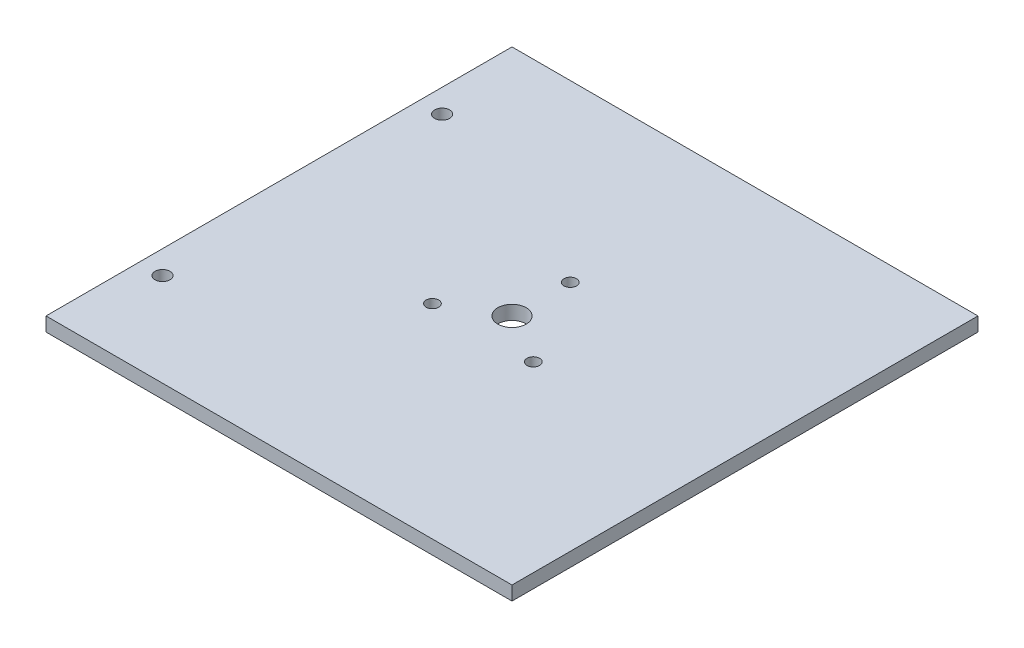
ISO-10303-21;
HEADER;
FILE_DESCRIPTION(('STEP AP214'),'2;1');
FILE_NAME('part.step','',(''),(''),'','','');
FILE_SCHEMA(('AUTOMOTIVE_DESIGN { 1 0 10303 214 1 1 1 1 }'));
ENDSEC;
DATA;
#1=APPLICATION_CONTEXT('core data for automotive mechanical design processes');
#2=APPLICATION_PROTOCOL_DEFINITION('international standard','automotive_design',2000,#1);
#3=PRODUCT_CONTEXT('',#1,'mechanical');
#4=PRODUCT('Part','Part','',(#3));
#5=PRODUCT_RELATED_PRODUCT_CATEGORY('part','',(#4));
#6=PRODUCT_DEFINITION_FORMATION('','',#4);
#7=PRODUCT_DEFINITION_CONTEXT('part definition',#1,'design');
#8=PRODUCT_DEFINITION('design','',#6,#7);
#9=PRODUCT_DEFINITION_SHAPE('','',#8);
#10=(LENGTH_UNIT() NAMED_UNIT(*) SI_UNIT(.MILLI.,.METRE.));
#11=(NAMED_UNIT(*) PLANE_ANGLE_UNIT() SI_UNIT($,.RADIAN.));
#12=(NAMED_UNIT(*) SI_UNIT($,.STERADIAN.) SOLID_ANGLE_UNIT());
#13=UNCERTAINTY_MEASURE_WITH_UNIT(LENGTH_MEASURE(1.E-05),#10,'distance_accuracy_value','');
#14=(GEOMETRIC_REPRESENTATION_CONTEXT(3) GLOBAL_UNCERTAINTY_ASSIGNED_CONTEXT((#13)) GLOBAL_UNIT_ASSIGNED_CONTEXT((#10,
#11,#12)) REPRESENTATION_CONTEXT('',''));
#15=CARTESIAN_POINT('',(0.,0.,0.));
#16=DIRECTION('',(0.,0.,1.));
#17=DIRECTION('',(1.,0.,0.));
#18=AXIS2_PLACEMENT_3D('',#15,#16,#17);
#19=CARTESIAN_POINT('',(-50.,-63.,-50.));
#20=DIRECTION('',(1.,0.,0.));
#21=DIRECTION('',(0.,0.,-1.));
#22=AXIS2_PLACEMENT_3D('',#19,#20,#21);
#23=PLANE('',#22);
#24=DIRECTION('',(0.,0.,-1.));
#25=VECTOR('',#24,1.);
#26=CARTESIAN_POINT('',(-50.,-60.,-50.));
#27=LINE('',#26,#25);
#28=CARTESIAN_POINT('',(-50.,-60.,50.));
#29=VERTEX_POINT('',#28);
#30=CARTESIAN_POINT('',(-50.,-60.,-50.));
#31=VERTEX_POINT('',#30);
#32=EDGE_CURVE('E99',#29,#31,#27,.T.);
#33=ORIENTED_EDGE('',*,*,#32,.T.);
#34=DIRECTION('',(0.,1.,0.));
#35=VECTOR('',#34,1.);
#36=CARTESIAN_POINT('',(-50.,-63.,-50.));
#37=LINE('',#36,#35);
#38=CARTESIAN_POINT('',(-50.,-63.,-50.));
#39=VERTEX_POINT('',#38);
#40=EDGE_CURVE('E11',#39,#31,#37,.T.);
#41=ORIENTED_EDGE('',*,*,#40,.F.);
#42=DIRECTION('',(0.,0.,-1.));
#43=VECTOR('',#42,1.);
#44=CARTESIAN_POINT('',(-50.,-63.,-50.));
#45=LINE('',#44,#43);
#46=CARTESIAN_POINT('',(-50.,-63.,50.));
#47=VERTEX_POINT('',#46);
#48=EDGE_CURVE('E87',#47,#39,#45,.T.);
#49=ORIENTED_EDGE('',*,*,#48,.F.);
#50=DIRECTION('',(0.,1.,0.));
#51=VECTOR('',#50,1.);
#52=CARTESIAN_POINT('',(-50.,-63.,50.));
#53=LINE('',#52,#51);
#54=EDGE_CURVE('E95',#47,#29,#53,.T.);
#55=ORIENTED_EDGE('',*,*,#54,.T.);
#56=EDGE_LOOP('',(#33,#41,#49,#55));
#57=FACE_BOUND('',#56,.T.);
#58=ADVANCED_FACE('F36',(#57),#23,.F.);
#59=CARTESIAN_POINT('',(-50.,-63.,-50.));
#60=DIRECTION('',(0.,0.,1.));
#61=DIRECTION('',(1.,0.,0.));
#62=AXIS2_PLACEMENT_3D('',#59,#60,#61);
#63=PLANE('',#62);
#64=DIRECTION('',(1.,0.,0.));
#65=VECTOR('',#64,1.);
#66=CARTESIAN_POINT('',(-50.,-60.,-50.));
#67=LINE('',#66,#65);
#68=CARTESIAN_POINT('',(50.,-60.,-50.));
#69=VERTEX_POINT('',#68);
#70=EDGE_CURVE('E91',#31,#69,#67,.T.);
#71=ORIENTED_EDGE('',*,*,#70,.T.);
#72=DIRECTION('',(0.,1.,0.));
#73=VECTOR('',#72,1.);
#74=CARTESIAN_POINT('',(50.,-63.,-50.));
#75=LINE('',#74,#73);
#76=CARTESIAN_POINT('',(50.,-63.,-50.));
#77=VERTEX_POINT('',#76);
#78=EDGE_CURVE('E44',#77,#69,#75,.T.);
#79=ORIENTED_EDGE('',*,*,#78,.F.);
#80=DIRECTION('',(1.,0.,0.));
#81=VECTOR('',#80,1.);
#82=CARTESIAN_POINT('',(-50.,-63.,-50.));
#83=LINE('',#82,#81);
#84=EDGE_CURVE('E82',#39,#77,#83,.T.);
#85=ORIENTED_EDGE('',*,*,#84,.F.);
#86=ORIENTED_EDGE('',*,*,#40,.T.);
#87=EDGE_LOOP('',(#71,#79,#85,#86));
#88=FACE_BOUND('',#87,.T.);
#89=ADVANCED_FACE('F90',(#88),#63,.F.);
#90=CARTESIAN_POINT('',(50.,-63.,-50.));
#91=DIRECTION('',(-1.,0.,0.));
#92=DIRECTION('',(0.,0.,1.));
#93=AXIS2_PLACEMENT_3D('',#90,#91,#92);
#94=PLANE('',#93);
#95=DIRECTION('',(0.,0.,1.));
#96=VECTOR('',#95,1.);
#97=CARTESIAN_POINT('',(50.,-60.,-50.));
#98=LINE('',#97,#96);
#99=CARTESIAN_POINT('',(50.,-60.,50.));
#100=VERTEX_POINT('',#99);
#101=EDGE_CURVE('E69',#69,#100,#98,.T.);
#102=ORIENTED_EDGE('',*,*,#101,.T.);
#103=DIRECTION('',(0.,1.,0.));
#104=VECTOR('',#103,1.);
#105=CARTESIAN_POINT('',(50.,-63.,50.));
#106=LINE('',#105,#104);
#107=CARTESIAN_POINT('',(50.,-63.,50.));
#108=VERTEX_POINT('',#107);
#109=EDGE_CURVE('E92',#108,#100,#106,.T.);
#110=ORIENTED_EDGE('',*,*,#109,.F.);
#111=DIRECTION('',(0.,0.,1.));
#112=VECTOR('',#111,1.);
#113=CARTESIAN_POINT('',(50.,-63.,-50.));
#114=LINE('',#113,#112);
#115=EDGE_CURVE('E85',#77,#108,#114,.T.);
#116=ORIENTED_EDGE('',*,*,#115,.F.);
#117=ORIENTED_EDGE('',*,*,#78,.T.);
#118=EDGE_LOOP('',(#102,#110,#116,#117));
#119=FACE_BOUND('',#118,.T.);
#120=ADVANCED_FACE('F93',(#119),#94,.F.);
#121=CARTESIAN_POINT('',(-50.,-63.,50.));
#122=DIRECTION('',(0.,0.,-1.));
#123=DIRECTION('',(-1.,0.,0.));
#124=AXIS2_PLACEMENT_3D('',#121,#122,#123);
#125=PLANE('',#124);
#126=DIRECTION('',(-1.,0.,0.));
#127=VECTOR('',#126,1.);
#128=CARTESIAN_POINT('',(-50.,-60.,50.));
#129=LINE('',#128,#127);
#130=EDGE_CURVE('E75',#100,#29,#129,.T.);
#131=ORIENTED_EDGE('',*,*,#130,.T.);
#132=ORIENTED_EDGE('',*,*,#54,.F.);
#133=DIRECTION('',(-1.,0.,0.));
#134=VECTOR('',#133,1.);
#135=CARTESIAN_POINT('',(-50.,-63.,50.));
#136=LINE('',#135,#134);
#137=EDGE_CURVE('E52',#108,#47,#136,.T.);
#138=ORIENTED_EDGE('',*,*,#137,.F.);
#139=ORIENTED_EDGE('',*,*,#109,.T.);
#140=EDGE_LOOP('',(#131,#132,#138,#139));
#141=FACE_BOUND('',#140,.T.);
#142=ADVANCED_FACE('F107',(#141),#125,.F.);
#143=CARTESIAN_POINT('',(0.,-63.,0.));
#144=DIRECTION('',(0.,1.,0.));
#145=DIRECTION('',(0.,0.,1.));
#146=AXIS2_PLACEMENT_3D('',#143,#144,#145);
#147=PLANE('',#146);
#148=CARTESIAN_POINT('',(-45.,-63.,-30.));
#149=DIRECTION('',(0.,-1.,0.));
#150=DIRECTION('',(0.,0.,-1.));
#151=AXIS2_PLACEMENT_3D('',#148,#149,#150);
#152=CIRCLE('',#151,1.6);
#153=CARTESIAN_POINT('',(-45.,-63.,-31.6));
#154=VERTEX_POINT('',#153);
#155=EDGE_CURVE('E123',#154,#154,#152,.T.);
#156=ORIENTED_EDGE('',*,*,#155,.F.);
#157=EDGE_LOOP('',(#156));
#158=FACE_BOUND('',#157,.T.);
#159=CARTESIAN_POINT('',(-45.,-63.,30.));
#160=DIRECTION('',(0.,-1.,0.));
#161=DIRECTION('',(0.,0.,-1.));
#162=AXIS2_PLACEMENT_3D('',#159,#160,#161);
#163=CIRCLE('',#162,1.6);
#164=CARTESIAN_POINT('',(-45.,-63.,28.4));
#165=VERTEX_POINT('',#164);
#166=EDGE_CURVE('E140',#165,#165,#163,.T.);
#167=ORIENTED_EDGE('',*,*,#166,.F.);
#168=EDGE_LOOP('',(#167));
#169=FACE_BOUND('',#168,.T.);
#170=CARTESIAN_POINT('',(10.8253175473055,-63.,6.25));
#171=DIRECTION('',(0.,-1.,0.));
#172=DIRECTION('',(0.,0.,-1.));
#173=AXIS2_PLACEMENT_3D('',#170,#171,#172);
#174=CIRCLE('',#173,1.35);
#175=CARTESIAN_POINT('',(10.8253175473055,-63.,4.9));
#176=VERTEX_POINT('',#175);
#177=EDGE_CURVE('E122',#176,#176,#174,.T.);
#178=ORIENTED_EDGE('',*,*,#177,.F.);
#179=EDGE_LOOP('',(#178));
#180=FACE_BOUND('',#179,.T.);
#181=CARTESIAN_POINT('',(-10.8253175473055,-63.,6.24999999999999));
#182=DIRECTION('',(0.,-1.,0.));
#183=DIRECTION('',(0.,0.,-1.));
#184=AXIS2_PLACEMENT_3D('',#181,#182,#183);
#185=CIRCLE('',#184,1.35);
#186=CARTESIAN_POINT('',(-10.8253175473055,-63.,4.89999999999999));
#187=VERTEX_POINT('',#186);
#188=EDGE_CURVE('E129',#187,#187,#185,.T.);
#189=ORIENTED_EDGE('',*,*,#188,.F.);
#190=EDGE_LOOP('',(#189));
#191=FACE_BOUND('',#190,.T.);
#192=CARTESIAN_POINT('',(0.,-63.,-12.5));
#193=DIRECTION('',(0.,-1.,0.));
#194=DIRECTION('',(0.,0.,-1.));
#195=AXIS2_PLACEMENT_3D('',#192,#193,#194);
#196=CIRCLE('',#195,1.35);
#197=CARTESIAN_POINT('',(0.,-63.,-13.85));
#198=VERTEX_POINT('',#197);
#199=EDGE_CURVE('E116',#198,#198,#196,.T.);
#200=ORIENTED_EDGE('',*,*,#199,.F.);
#201=EDGE_LOOP('',(#200));
#202=FACE_BOUND('',#201,.T.);
#203=CARTESIAN_POINT('',(0.,-63.,0.));
#204=DIRECTION('',(0.,-1.,0.));
#205=DIRECTION('',(0.,0.,-1.));
#206=AXIS2_PLACEMENT_3D('',#203,#204,#205);
#207=CIRCLE('',#206,3.05);
#208=CARTESIAN_POINT('',(0.,-63.,-3.05));
#209=VERTEX_POINT('',#208);
#210=EDGE_CURVE('E102',#209,#209,#207,.T.);
#211=ORIENTED_EDGE('',*,*,#210,.F.);
#212=EDGE_LOOP('',(#211));
#213=FACE_BOUND('',#212,.T.);
#214=ORIENTED_EDGE('',*,*,#48,.T.);
#215=ORIENTED_EDGE('',*,*,#84,.T.);
#216=ORIENTED_EDGE('',*,*,#115,.T.);
#217=ORIENTED_EDGE('',*,*,#137,.T.);
#218=EDGE_LOOP('',(#214,#215,#216,#217));
#219=FACE_BOUND('',#218,.T.);
#220=ADVANCED_FACE('F83',(#158,#169,#180,#191,#202,#213,#219),#147,.F.);
#221=CARTESIAN_POINT('',(0.,-60.,0.));
#222=DIRECTION('',(0.,1.,0.));
#223=DIRECTION('',(0.,0.,1.));
#224=AXIS2_PLACEMENT_3D('',#221,#222,#223);
#225=PLANE('',#224);
#226=CARTESIAN_POINT('',(-45.,-60.,-30.));
#227=DIRECTION('',(0.,1.,0.));
#228=DIRECTION('',(0.,0.,1.));
#229=AXIS2_PLACEMENT_3D('',#226,#227,#228);
#230=CIRCLE('',#229,1.6);
#231=CARTESIAN_POINT('',(-45.,-60.,-28.4));
#232=VERTEX_POINT('',#231);
#233=EDGE_CURVE('E143',#232,#232,#230,.F.);
#234=ORIENTED_EDGE('',*,*,#233,.T.);
#235=EDGE_LOOP('',(#234));
#236=FACE_BOUND('',#235,.T.);
#237=CARTESIAN_POINT('',(-45.,-60.,30.));
#238=DIRECTION('',(0.,1.,0.));
#239=DIRECTION('',(0.,0.,1.));
#240=AXIS2_PLACEMENT_3D('',#237,#238,#239);
#241=CIRCLE('',#240,1.6);
#242=CARTESIAN_POINT('',(-45.,-60.,31.6));
#243=VERTEX_POINT('',#242);
#244=EDGE_CURVE('E137',#243,#243,#241,.F.);
#245=ORIENTED_EDGE('',*,*,#244,.T.);
#246=EDGE_LOOP('',(#245));
#247=FACE_BOUND('',#246,.T.);
#248=CARTESIAN_POINT('',(10.8253175473055,-60.,6.25));
#249=DIRECTION('',(0.,1.,0.));
#250=DIRECTION('',(0.,0.,1.));
#251=AXIS2_PLACEMENT_3D('',#248,#249,#250);
#252=CIRCLE('',#251,1.35);
#253=CARTESIAN_POINT('',(10.8253175473055,-60.,7.6));
#254=VERTEX_POINT('',#253);
#255=EDGE_CURVE('E119',#254,#254,#252,.F.);
#256=ORIENTED_EDGE('',*,*,#255,.T.);
#257=EDGE_LOOP('',(#256));
#258=FACE_BOUND('',#257,.T.);
#259=CARTESIAN_POINT('',(-10.8253175473055,-60.,6.24999999999999));
#260=DIRECTION('',(0.,1.,0.));
#261=DIRECTION('',(0.,0.,1.));
#262=AXIS2_PLACEMENT_3D('',#259,#260,#261);
#263=CIRCLE('',#262,1.35);
#264=CARTESIAN_POINT('',(-10.8253175473055,-60.,7.59999999999999));
#265=VERTEX_POINT('',#264);
#266=EDGE_CURVE('E126',#265,#265,#263,.F.);
#267=ORIENTED_EDGE('',*,*,#266,.T.);
#268=EDGE_LOOP('',(#267));
#269=FACE_BOUND('',#268,.T.);
#270=CARTESIAN_POINT('',(0.,-60.,-12.5));
#271=DIRECTION('',(0.,1.,0.));
#272=DIRECTION('',(0.,0.,1.));
#273=AXIS2_PLACEMENT_3D('',#270,#271,#272);
#274=CIRCLE('',#273,1.35);
#275=CARTESIAN_POINT('',(0.,-60.,-11.15));
#276=VERTEX_POINT('',#275);
#277=EDGE_CURVE('E132',#276,#276,#274,.F.);
#278=ORIENTED_EDGE('',*,*,#277,.T.);
#279=EDGE_LOOP('',(#278));
#280=FACE_BOUND('',#279,.T.);
#281=CARTESIAN_POINT('',(0.,-60.,0.));
#282=DIRECTION('',(0.,1.,0.));
#283=DIRECTION('',(0.,0.,1.));
#284=AXIS2_PLACEMENT_3D('',#281,#282,#283);
#285=CIRCLE('',#284,3.05);
#286=CARTESIAN_POINT('',(0.,-60.,3.05));
#287=VERTEX_POINT('',#286);
#288=EDGE_CURVE('E113',#287,#287,#285,.F.);
#289=ORIENTED_EDGE('',*,*,#288,.T.);
#290=EDGE_LOOP('',(#289));
#291=FACE_BOUND('',#290,.T.);
#292=ORIENTED_EDGE('',*,*,#32,.F.);
#293=ORIENTED_EDGE('',*,*,#130,.F.);
#294=ORIENTED_EDGE('',*,*,#101,.F.);
#295=ORIENTED_EDGE('',*,*,#70,.F.);
#296=EDGE_LOOP('',(#292,#293,#294,#295));
#297=FACE_BOUND('',#296,.T.);
#298=ADVANCED_FACE('F110',(#236,#247,#258,#269,#280,#291,#297),#225,.T.);
#299=CARTESIAN_POINT('',(0.,133.001,0.));
#300=DIRECTION('',(0.,-1.,0.));
#301=DIRECTION('',(0.,0.,-1.));
#302=AXIS2_PLACEMENT_3D('',#299,#300,#301);
#303=CYLINDRICAL_SURFACE('',#302,3.05);
#304=ORIENTED_EDGE('',*,*,#288,.F.);
#305=EDGE_LOOP('',(#304));
#306=FACE_BOUND('',#305,.T.);
#307=ORIENTED_EDGE('',*,*,#210,.T.);
#308=EDGE_LOOP('',(#307));
#309=FACE_BOUND('',#308,.T.);
#310=ADVANCED_FACE('F164',(#306,#309),#303,.F.);
#311=CARTESIAN_POINT('',(0.,133.001,-12.5));
#312=DIRECTION('',(0.,-1.,0.));
#313=DIRECTION('',(0.,0.,-1.));
#314=AXIS2_PLACEMENT_3D('',#311,#312,#313);
#315=CYLINDRICAL_SURFACE('',#314,1.35);
#316=ORIENTED_EDGE('',*,*,#277,.F.);
#317=EDGE_LOOP('',(#316));
#318=FACE_BOUND('',#317,.T.);
#319=ORIENTED_EDGE('',*,*,#199,.T.);
#320=EDGE_LOOP('',(#319));
#321=FACE_BOUND('',#320,.T.);
#322=ADVANCED_FACE('F166',(#318,#321),#315,.F.);
#323=CARTESIAN_POINT('',(-10.8253175473055,133.001,6.24999999999999));
#324=DIRECTION('',(0.,-1.,0.));
#325=DIRECTION('',(0.,0.,-1.));
#326=AXIS2_PLACEMENT_3D('',#323,#324,#325);
#327=CYLINDRICAL_SURFACE('',#326,1.35);
#328=ORIENTED_EDGE('',*,*,#266,.F.);
#329=EDGE_LOOP('',(#328));
#330=FACE_BOUND('',#329,.T.);
#331=ORIENTED_EDGE('',*,*,#188,.T.);
#332=EDGE_LOOP('',(#331));
#333=FACE_BOUND('',#332,.T.);
#334=ADVANCED_FACE('F173',(#330,#333),#327,.F.);
#335=CARTESIAN_POINT('',(10.8253175473055,133.001,6.25));
#336=DIRECTION('',(0.,-1.,0.));
#337=DIRECTION('',(0.,0.,-1.));
#338=AXIS2_PLACEMENT_3D('',#335,#336,#337);
#339=CYLINDRICAL_SURFACE('',#338,1.35);
#340=ORIENTED_EDGE('',*,*,#255,.F.);
#341=EDGE_LOOP('',(#340));
#342=FACE_BOUND('',#341,.T.);
#343=ORIENTED_EDGE('',*,*,#177,.T.);
#344=EDGE_LOOP('',(#343));
#345=FACE_BOUND('',#344,.T.);
#346=ADVANCED_FACE('F225',(#342,#345),#339,.F.);
#347=CARTESIAN_POINT('',(-45.,133.001,30.));
#348=DIRECTION('',(0.,-1.,0.));
#349=DIRECTION('',(0.,0.,-1.));
#350=AXIS2_PLACEMENT_3D('',#347,#348,#349);
#351=CYLINDRICAL_SURFACE('',#350,1.6);
#352=ORIENTED_EDGE('',*,*,#244,.F.);
#353=EDGE_LOOP('',(#352));
#354=FACE_BOUND('',#353,.T.);
#355=ORIENTED_EDGE('',*,*,#166,.T.);
#356=EDGE_LOOP('',(#355));
#357=FACE_BOUND('',#356,.T.);
#358=ADVANCED_FACE('F235',(#354,#357),#351,.F.);
#359=CARTESIAN_POINT('',(-45.,133.001,-30.));
#360=DIRECTION('',(0.,-1.,0.));
#361=DIRECTION('',(0.,0.,-1.));
#362=AXIS2_PLACEMENT_3D('',#359,#360,#361);
#363=CYLINDRICAL_SURFACE('',#362,1.6);
#364=ORIENTED_EDGE('',*,*,#233,.F.);
#365=EDGE_LOOP('',(#364));
#366=FACE_BOUND('',#365,.T.);
#367=ORIENTED_EDGE('',*,*,#155,.T.);
#368=EDGE_LOOP('',(#367));
#369=FACE_BOUND('',#368,.T.);
#370=ADVANCED_FACE('F149',(#366,#369),#363,.F.);
#371=CLOSED_SHELL('',(#58,#89,#120,#142,#220,#298,#310,#322,#334,#346,#358,#370));
#372=MANIFOLD_SOLID_BREP('B2',#371);
#373=ADVANCED_BREP_SHAPE_REPRESENTATION('',(#18,#372),#14);
#374=SHAPE_DEFINITION_REPRESENTATION(#9,#373);
ENDSEC;
END-ISO-10303-21;
